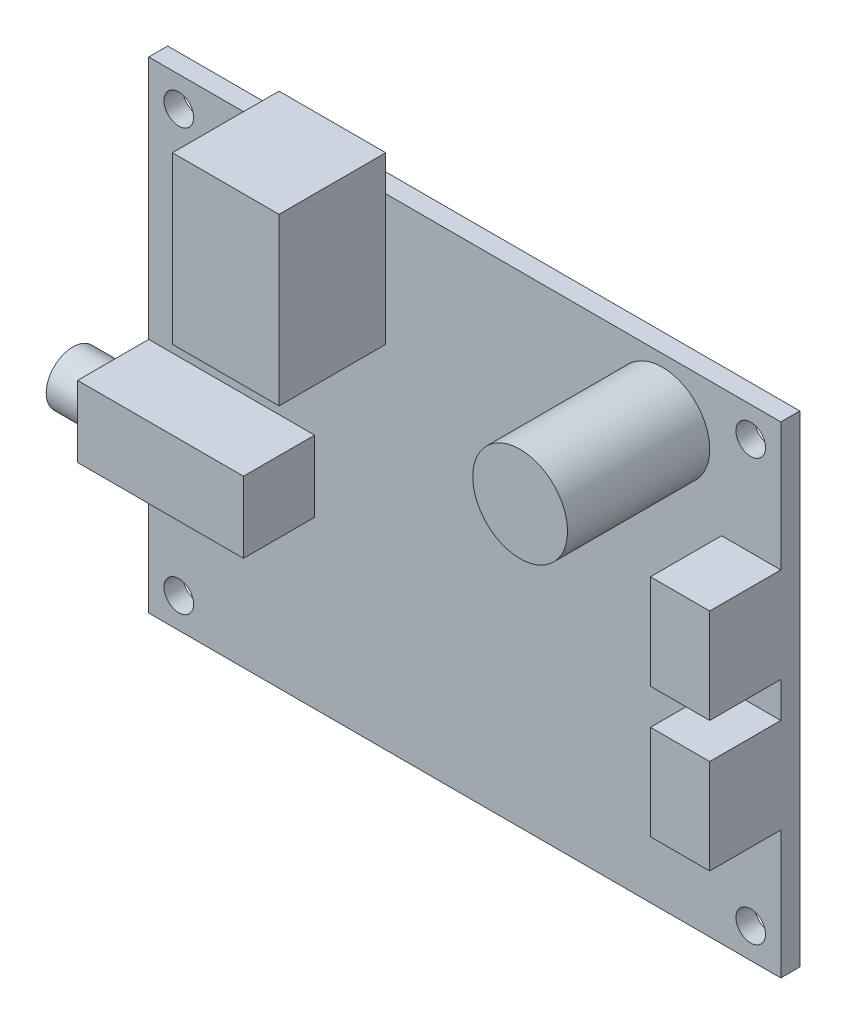
ISO-10303-21;
HEADER;
FILE_DESCRIPTION(('STEP AP214'),'2;1');
FILE_NAME('part.step','',(''),(''),'','','');
FILE_SCHEMA(('AUTOMOTIVE_DESIGN { 1 0 10303 214 1 1 1 1 }'));
ENDSEC;
DATA;
#1=APPLICATION_CONTEXT('core data for automotive mechanical design processes');
#2=APPLICATION_PROTOCOL_DEFINITION('international standard','automotive_design',2000,#1);
#3=PRODUCT_CONTEXT('',#1,'mechanical');
#4=PRODUCT('Part','Part','',(#3));
#5=PRODUCT_RELATED_PRODUCT_CATEGORY('part','',(#4));
#6=PRODUCT_DEFINITION_FORMATION('','',#4);
#7=PRODUCT_DEFINITION_CONTEXT('part definition',#1,'design');
#8=PRODUCT_DEFINITION('design','',#6,#7);
#9=PRODUCT_DEFINITION_SHAPE('','',#8);
#10=(LENGTH_UNIT() NAMED_UNIT(*) SI_UNIT(.MILLI.,.METRE.));
#11=(NAMED_UNIT(*) PLANE_ANGLE_UNIT() SI_UNIT($,.RADIAN.));
#12=(NAMED_UNIT(*) SI_UNIT($,.STERADIAN.) SOLID_ANGLE_UNIT());
#13=UNCERTAINTY_MEASURE_WITH_UNIT(LENGTH_MEASURE(1.E-05),#10,'distance_accuracy_value','');
#14=(GEOMETRIC_REPRESENTATION_CONTEXT(3) GLOBAL_UNCERTAINTY_ASSIGNED_CONTEXT((#13)) GLOBAL_UNIT_ASSIGNED_CONTEXT((#10,
#11,#12)) REPRESENTATION_CONTEXT('',''));
#15=CARTESIAN_POINT('',(0.,0.,0.));
#16=DIRECTION('',(0.,0.,1.));
#17=DIRECTION('',(1.,0.,0.));
#18=AXIS2_PLACEMENT_3D('',#15,#16,#17);
#19=CARTESIAN_POINT('',(0.,0.,1.6));
#20=DIRECTION('',(0.,0.,1.));
#21=DIRECTION('',(1.,0.,0.));
#22=AXIS2_PLACEMENT_3D('',#19,#20,#21);
#23=PLANE('',#22);
#24=CARTESIAN_POINT('',(16.67,15.32,1.6));
#25=DIRECTION('',(0.,0.,1.));
#26=DIRECTION('',(1.,0.,0.));
#27=AXIS2_PLACEMENT_3D('',#24,#25,#26);
#28=CIRCLE('',#27,4.);
#29=CARTESIAN_POINT('',(20.67,15.32,1.6));
#30=VERTEX_POINT('',#29);
#31=EDGE_CURVE('E476',#30,#30,#28,.T.);
#32=ORIENTED_EDGE('',*,*,#31,.F.);
#33=EDGE_LOOP('',(#32));
#34=FACE_BOUND('',#33,.T.);
#35=CARTESIAN_POINT('',(24.13,17.78,1.6));
#36=DIRECTION('',(0.,0.,1.));
#37=DIRECTION('',(1.,0.,0.));
#38=AXIS2_PLACEMENT_3D('',#35,#36,#37);
#39=CIRCLE('',#38,1.25);
#40=CARTESIAN_POINT('',(25.38,17.78,1.6));
#41=VERTEX_POINT('',#40);
#42=EDGE_CURVE('E353',#41,#41,#39,.T.);
#43=ORIENTED_EDGE('',*,*,#42,.F.);
#44=EDGE_LOOP('',(#43));
#45=FACE_BOUND('',#44,.T.);
#46=CARTESIAN_POINT('',(-24.13,17.78,1.6));
#47=DIRECTION('',(0.,0.,1.));
#48=DIRECTION('',(1.,0.,0.));
#49=AXIS2_PLACEMENT_3D('',#46,#47,#48);
#50=CIRCLE('',#49,1.25);
#51=CARTESIAN_POINT('',(-22.88,17.78,1.6));
#52=VERTEX_POINT('',#51);
#53=EDGE_CURVE('E369',#52,#52,#50,.T.);
#54=ORIENTED_EDGE('',*,*,#53,.F.);
#55=EDGE_LOOP('',(#54));
#56=FACE_BOUND('',#55,.T.);
#57=CARTESIAN_POINT('',(24.13,-17.78,1.6));
#58=DIRECTION('',(0.,0.,1.));
#59=DIRECTION('',(1.,0.,0.));
#60=AXIS2_PLACEMENT_3D('',#57,#58,#59);
#61=CIRCLE('',#60,1.25);
#62=CARTESIAN_POINT('',(25.38,-17.78,1.6));
#63=VERTEX_POINT('',#62);
#64=EDGE_CURVE('E361',#63,#63,#61,.T.);
#65=ORIENTED_EDGE('',*,*,#64,.F.);
#66=EDGE_LOOP('',(#65));
#67=FACE_BOUND('',#66,.T.);
#68=CARTESIAN_POINT('',(-24.13,-17.78,1.6));
#69=DIRECTION('',(0.,0.,1.));
#70=DIRECTION('',(1.,0.,0.));
#71=AXIS2_PLACEMENT_3D('',#68,#69,#70);
#72=CIRCLE('',#71,1.25);
#73=CARTESIAN_POINT('',(-22.88,-17.78,1.6));
#74=VERTEX_POINT('',#73);
#75=EDGE_CURVE('E345',#74,#74,#72,.T.);
#76=ORIENTED_EDGE('',*,*,#75,.F.);
#77=EDGE_LOOP('',(#76));
#78=FACE_BOUND('',#77,.T.);
#79=DIRECTION('',(1.,0.,0.));
#80=VECTOR('',#79,1.);
#81=CARTESIAN_POINT('',(-15.67,9.32,1.6));
#82=LINE('',#81,#80);
#83=CARTESIAN_POINT('',(-15.67,9.32,1.6));
#84=VERTEX_POINT('',#83);
#85=CARTESIAN_POINT('',(-6.67000000000001,9.32,1.6));
#86=VERTEX_POINT('',#85);
#87=EDGE_CURVE('E56',#84,#86,#82,.T.);
#88=ORIENTED_EDGE('',*,*,#87,.F.);
#89=DIRECTION('',(0.,-1.,0.));
#90=VECTOR('',#89,1.);
#91=CARTESIAN_POINT('',(-15.67,23.32,1.6));
#92=LINE('',#91,#90);
#93=CARTESIAN_POINT('',(-15.67,20.32,1.6));
#94=VERTEX_POINT('',#93);
#95=EDGE_CURVE('E209',#94,#84,#92,.T.);
#96=ORIENTED_EDGE('',*,*,#95,.F.);
#97=DIRECTION('',(-1.,0.,0.));
#98=VECTOR('',#97,1.);
#99=CARTESIAN_POINT('',(-26.67,20.32,1.6));
#100=LINE('',#99,#98);
#101=CARTESIAN_POINT('',(-26.67,20.32,1.6));
#102=VERTEX_POINT('',#101);
#103=EDGE_CURVE('E388',#94,#102,#100,.T.);
#104=ORIENTED_EDGE('',*,*,#103,.T.);
#105=DIRECTION('',(0.,-1.,0.));
#106=VECTOR('',#105,1.);
#107=CARTESIAN_POINT('',(-26.67,20.32,1.6));
#108=LINE('',#107,#106);
#109=CARTESIAN_POINT('',(-26.67,-0.319999999999997,1.6));
#110=VERTEX_POINT('',#109);
#111=EDGE_CURVE('E377',#102,#110,#108,.T.);
#112=ORIENTED_EDGE('',*,*,#111,.T.);
#113=DIRECTION('',(-1.,0.,0.));
#114=VECTOR('',#113,1.);
#115=CARTESIAN_POINT('',(-26.67,-0.319999999999997,1.6));
#116=LINE('',#115,#114);
#117=CARTESIAN_POINT('',(-12.67,-0.319999999999997,1.6));
#118=VERTEX_POINT('',#117);
#119=EDGE_CURVE('E309',#118,#110,#116,.T.);
#120=ORIENTED_EDGE('',*,*,#119,.F.);
#121=DIRECTION('',(0.,1.,0.));
#122=VECTOR('',#121,1.);
#123=CARTESIAN_POINT('',(-12.67,-0.319999999999997,1.6));
#124=LINE('',#123,#122);
#125=CARTESIAN_POINT('',(-12.67,-6.32,1.6));
#126=VERTEX_POINT('',#125);
#127=EDGE_CURVE('E322',#126,#118,#124,.T.);
#128=ORIENTED_EDGE('',*,*,#127,.F.);
#129=DIRECTION('',(1.,0.,0.));
#130=VECTOR('',#129,1.);
#131=CARTESIAN_POINT('',(-26.67,-6.32,1.6));
#132=LINE('',#131,#130);
#133=CARTESIAN_POINT('',(-26.67,-6.32,1.6));
#134=VERTEX_POINT('',#133);
#135=EDGE_CURVE('E303',#134,#126,#132,.T.);
#136=ORIENTED_EDGE('',*,*,#135,.F.);
#137=CARTESIAN_POINT('',(-26.67,-20.32,1.6));
#138=VERTEX_POINT('',#137);
#139=EDGE_CURVE('E381',#134,#138,#108,.T.);
#140=ORIENTED_EDGE('',*,*,#139,.T.);
#141=DIRECTION('',(1.,0.,0.));
#142=VECTOR('',#141,1.);
#143=CARTESIAN_POINT('',(-26.67,-20.32,1.6));
#144=LINE('',#143,#142);
#145=CARTESIAN_POINT('',(26.67,-20.32,1.6));
#146=VERTEX_POINT('',#145);
#147=EDGE_CURVE('E380',#138,#146,#144,.T.);
#148=ORIENTED_EDGE('',*,*,#147,.T.);
#149=DIRECTION('',(0.,1.,0.));
#150=VECTOR('',#149,1.);
#151=CARTESIAN_POINT('',(26.67,20.32,1.6));
#152=LINE('',#151,#150);
#153=CARTESIAN_POINT('',(26.67,-9.5,1.6));
#154=VERTEX_POINT('',#153);
#155=EDGE_CURVE('E385',#146,#154,#152,.T.);
#156=ORIENTED_EDGE('',*,*,#155,.T.);
#157=DIRECTION('',(1.,0.,0.));
#158=VECTOR('',#157,1.);
#159=CARTESIAN_POINT('',(26.67,-9.5,1.6));
#160=LINE('',#159,#158);
#161=CARTESIAN_POINT('',(21.67,-9.5,1.6));
#162=VERTEX_POINT('',#161);
#163=EDGE_CURVE('E227',#162,#154,#160,.T.);
#164=ORIENTED_EDGE('',*,*,#163,.F.);
#165=DIRECTION('',(0.,-1.,0.));
#166=VECTOR('',#165,1.);
#167=CARTESIAN_POINT('',(21.67,-9.5,1.6));
#168=LINE('',#167,#166);
#169=CARTESIAN_POINT('',(21.67,-1.5,1.6));
#170=VERTEX_POINT('',#169);
#171=EDGE_CURVE('E240',#170,#162,#168,.T.);
#172=ORIENTED_EDGE('',*,*,#171,.F.);
#173=DIRECTION('',(-1.,0.,0.));
#174=VECTOR('',#173,1.);
#175=CARTESIAN_POINT('',(26.67,-1.5,1.6));
#176=LINE('',#175,#174);
#177=CARTESIAN_POINT('',(26.67,-1.5,1.6));
#178=VERTEX_POINT('',#177);
#179=EDGE_CURVE('E216',#178,#170,#176,.T.);
#180=ORIENTED_EDGE('',*,*,#179,.F.);
#181=CARTESIAN_POINT('',(26.67,1.5,1.6));
#182=VERTEX_POINT('',#181);
#183=EDGE_CURVE('E389',#178,#182,#152,.T.);
#184=ORIENTED_EDGE('',*,*,#183,.T.);
#185=DIRECTION('',(1.,0.,0.));
#186=VECTOR('',#185,1.);
#187=CARTESIAN_POINT('',(26.67,1.5,1.6));
#188=LINE('',#187,#186);
#189=CARTESIAN_POINT('',(21.67,1.5,1.6));
#190=VERTEX_POINT('',#189);
#191=EDGE_CURVE('E268',#190,#182,#188,.T.);
#192=ORIENTED_EDGE('',*,*,#191,.F.);
#193=DIRECTION('',(0.,-1.,0.));
#194=VECTOR('',#193,1.);
#195=CARTESIAN_POINT('',(21.67,9.5,1.6));
#196=LINE('',#195,#194);
#197=CARTESIAN_POINT('',(21.67,9.5,1.6));
#198=VERTEX_POINT('',#197);
#199=EDGE_CURVE('E281',#198,#190,#196,.T.);
#200=ORIENTED_EDGE('',*,*,#199,.F.);
#201=DIRECTION('',(-1.,0.,0.));
#202=VECTOR('',#201,1.);
#203=CARTESIAN_POINT('',(26.67,9.5,1.6));
#204=LINE('',#203,#202);
#205=CARTESIAN_POINT('',(26.67,9.5,1.6));
#206=VERTEX_POINT('',#205);
#207=EDGE_CURVE('E262',#206,#198,#204,.T.);
#208=ORIENTED_EDGE('',*,*,#207,.F.);
#209=CARTESIAN_POINT('',(26.67,20.32,1.6));
#210=VERTEX_POINT('',#209);
#211=EDGE_CURVE('E384',#206,#210,#152,.T.);
#212=ORIENTED_EDGE('',*,*,#211,.T.);
#213=CARTESIAN_POINT('',(-6.67000000000001,20.32,1.6));
#214=VERTEX_POINT('',#213);
#215=EDGE_CURVE('E390',#210,#214,#100,.T.);
#216=ORIENTED_EDGE('',*,*,#215,.T.);
#217=DIRECTION('',(0.,1.,0.));
#218=VECTOR('',#217,1.);
#219=CARTESIAN_POINT('',(-6.67000000000001,23.32,1.6));
#220=LINE('',#219,#218);
#221=EDGE_CURVE('E61',#86,#214,#220,.T.);
#222=ORIENTED_EDGE('',*,*,#221,.F.);
#223=EDGE_LOOP('',(#88,#96,#104,#112,#120,#128,#136,#140,#148,#156,#164,#172,#180,#184,#192,
#200,#208,#212,#216,#222));
#224=FACE_BOUND('',#223,.T.);
#225=ADVANCED_FACE('F39',(#34,#45,#56,#67,#78,#224),#23,.T.);
#226=CARTESIAN_POINT('',(0.,0.,0.));
#227=DIRECTION('',(0.,0.,1.));
#228=DIRECTION('',(1.,0.,0.));
#229=AXIS2_PLACEMENT_3D('',#226,#227,#228);
#230=PLANE('',#229);
#231=DIRECTION('',(0.,-1.,0.));
#232=VECTOR('',#231,1.);
#233=CARTESIAN_POINT('',(-26.67,20.32,0.));
#234=LINE('',#233,#232);
#235=CARTESIAN_POINT('',(-26.67,20.32,0.));
#236=VERTEX_POINT('',#235);
#237=CARTESIAN_POINT('',(-26.67,-20.32,0.));
#238=VERTEX_POINT('',#237);
#239=EDGE_CURVE('E373',#236,#238,#234,.T.);
#240=ORIENTED_EDGE('',*,*,#239,.F.);
#241=DIRECTION('',(-1.,0.,0.));
#242=VECTOR('',#241,1.);
#243=CARTESIAN_POINT('',(-26.67,20.32,0.));
#244=LINE('',#243,#242);
#245=CARTESIAN_POINT('',(26.67,20.32,0.));
#246=VERTEX_POINT('',#245);
#247=EDGE_CURVE('E404',#246,#236,#244,.T.);
#248=ORIENTED_EDGE('',*,*,#247,.F.);
#249=DIRECTION('',(0.,1.,0.));
#250=VECTOR('',#249,1.);
#251=CARTESIAN_POINT('',(26.67,20.32,0.));
#252=LINE('',#251,#250);
#253=CARTESIAN_POINT('',(26.67,-20.32,0.));
#254=VERTEX_POINT('',#253);
#255=EDGE_CURVE('E401',#254,#246,#252,.T.);
#256=ORIENTED_EDGE('',*,*,#255,.F.);
#257=DIRECTION('',(1.,0.,0.));
#258=VECTOR('',#257,1.);
#259=CARTESIAN_POINT('',(-26.67,-20.32,0.));
#260=LINE('',#259,#258);
#261=EDGE_CURVE('E398',#238,#254,#260,.T.);
#262=ORIENTED_EDGE('',*,*,#261,.F.);
#263=EDGE_LOOP('',(#240,#248,#256,#262));
#264=FACE_BOUND('',#263,.T.);
#265=CARTESIAN_POINT('',(-24.13,17.78,0.));
#266=DIRECTION('',(0.,0.,1.));
#267=DIRECTION('',(1.,0.,0.));
#268=AXIS2_PLACEMENT_3D('',#265,#266,#267);
#269=CIRCLE('',#268,1.25);
#270=CARTESIAN_POINT('',(-22.88,17.78,0.));
#271=VERTEX_POINT('',#270);
#272=EDGE_CURVE('E365',#271,#271,#269,.T.);
#273=ORIENTED_EDGE('',*,*,#272,.T.);
#274=EDGE_LOOP('',(#273));
#275=FACE_BOUND('',#274,.T.);
#276=CARTESIAN_POINT('',(24.13,-17.78,0.));
#277=DIRECTION('',(0.,0.,1.));
#278=DIRECTION('',(1.,0.,0.));
#279=AXIS2_PLACEMENT_3D('',#276,#277,#278);
#280=CIRCLE('',#279,1.25);
#281=CARTESIAN_POINT('',(25.38,-17.78,0.));
#282=VERTEX_POINT('',#281);
#283=EDGE_CURVE('E357',#282,#282,#280,.T.);
#284=ORIENTED_EDGE('',*,*,#283,.T.);
#285=EDGE_LOOP('',(#284));
#286=FACE_BOUND('',#285,.T.);
#287=CARTESIAN_POINT('',(24.13,17.78,0.));
#288=DIRECTION('',(0.,0.,1.));
#289=DIRECTION('',(1.,0.,0.));
#290=AXIS2_PLACEMENT_3D('',#287,#288,#289);
#291=CIRCLE('',#290,1.25);
#292=CARTESIAN_POINT('',(25.38,17.78,0.));
#293=VERTEX_POINT('',#292);
#294=EDGE_CURVE('E349',#293,#293,#291,.T.);
#295=ORIENTED_EDGE('',*,*,#294,.T.);
#296=EDGE_LOOP('',(#295));
#297=FACE_BOUND('',#296,.T.);
#298=CARTESIAN_POINT('',(-24.13,-17.78,0.));
#299=DIRECTION('',(0.,0.,1.));
#300=DIRECTION('',(1.,0.,0.));
#301=AXIS2_PLACEMENT_3D('',#298,#299,#300);
#302=CIRCLE('',#301,1.25);
#303=CARTESIAN_POINT('',(-22.88,-17.78,0.));
#304=VERTEX_POINT('',#303);
#305=EDGE_CURVE('E344',#304,#304,#302,.T.);
#306=ORIENTED_EDGE('',*,*,#305,.T.);
#307=EDGE_LOOP('',(#306));
#308=FACE_BOUND('',#307,.T.);
#309=ADVANCED_FACE('F433',(#264,#275,#286,#297,#308),#230,.F.);
#310=CARTESIAN_POINT('',(-26.67,20.32,1.6));
#311=DIRECTION('',(1.,0.,0.));
#312=DIRECTION('',(0.,1.,0.));
#313=AXIS2_PLACEMENT_3D('',#310,#311,#312);
#314=PLANE('',#313);
#315=CARTESIAN_POINT('',(-26.67,-3.32,4.6));
#316=DIRECTION('',(-1.,0.,0.));
#317=DIRECTION('',(0.,-1.,0.));
#318=AXIS2_PLACEMENT_3D('',#315,#316,#317);
#319=CIRCLE('',#318,2.25);
#320=CARTESIAN_POINT('',(-26.67,-5.57,4.6));
#321=VERTEX_POINT('',#320);
#322=EDGE_CURVE('E11',#321,#321,#319,.T.);
#323=ORIENTED_EDGE('',*,*,#322,.F.);
#324=EDGE_LOOP('',(#323));
#325=FACE_BOUND('',#324,.T.);
#326=ORIENTED_EDGE('',*,*,#239,.T.);
#327=DIRECTION('',(0.,0.,-1.));
#328=VECTOR('',#327,1.);
#329=CARTESIAN_POINT('',(-26.67,-20.32,1.6));
#330=LINE('',#329,#328);
#331=EDGE_CURVE('E43',#138,#238,#330,.T.);
#332=ORIENTED_EDGE('',*,*,#331,.F.);
#333=ORIENTED_EDGE('',*,*,#139,.F.);
#334=DIRECTION('',(0.,0.,-1.));
#335=VECTOR('',#334,1.);
#336=CARTESIAN_POINT('',(-26.67,-6.32,7.6));
#337=LINE('',#336,#335);
#338=CARTESIAN_POINT('',(-26.67,-6.32,7.6));
#339=VERTEX_POINT('',#338);
#340=EDGE_CURVE('E340',#339,#134,#337,.T.);
#341=ORIENTED_EDGE('',*,*,#340,.F.);
#342=DIRECTION('',(0.,-1.,0.));
#343=VECTOR('',#342,1.);
#344=CARTESIAN_POINT('',(-26.67,-0.319999999999997,7.6));
#345=LINE('',#344,#343);
#346=CARTESIAN_POINT('',(-26.67,-0.319999999999997,7.6));
#347=VERTEX_POINT('',#346);
#348=EDGE_CURVE('E304',#347,#339,#345,.T.);
#349=ORIENTED_EDGE('',*,*,#348,.F.);
#350=DIRECTION('',(0.,0.,-1.));
#351=VECTOR('',#350,1.);
#352=CARTESIAN_POINT('',(-26.67,-0.319999999999997,7.6));
#353=LINE('',#352,#351);
#354=EDGE_CURVE('E318',#347,#110,#353,.T.);
#355=ORIENTED_EDGE('',*,*,#354,.T.);
#356=ORIENTED_EDGE('',*,*,#111,.F.);
#357=DIRECTION('',(0.,0.,-1.));
#358=VECTOR('',#357,1.);
#359=CARTESIAN_POINT('',(-26.67,20.32,1.6));
#360=LINE('',#359,#358);
#361=EDGE_CURVE('E393',#102,#236,#360,.T.);
#362=ORIENTED_EDGE('',*,*,#361,.T.);
#363=EDGE_LOOP('',(#326,#332,#333,#341,#349,#355,#356,#362));
#364=FACE_BOUND('',#363,.T.);
#365=ADVANCED_FACE('F41',(#325,#364),#314,.F.);
#366=CARTESIAN_POINT('',(-26.67,-20.32,1.6));
#367=DIRECTION('',(0.,1.,0.));
#368=DIRECTION('',(0.,0.,1.));
#369=AXIS2_PLACEMENT_3D('',#366,#367,#368);
#370=PLANE('',#369);
#371=ORIENTED_EDGE('',*,*,#261,.T.);
#372=DIRECTION('',(0.,0.,-1.));
#373=VECTOR('',#372,1.);
#374=CARTESIAN_POINT('',(26.67,-20.32,1.6));
#375=LINE('',#374,#373);
#376=EDGE_CURVE('E413',#146,#254,#375,.T.);
#377=ORIENTED_EDGE('',*,*,#376,.F.);
#378=ORIENTED_EDGE('',*,*,#147,.F.);
#379=ORIENTED_EDGE('',*,*,#331,.T.);
#380=EDGE_LOOP('',(#371,#377,#378,#379));
#381=FACE_BOUND('',#380,.T.);
#382=ADVANCED_FACE('F425',(#381),#370,.F.);
#383=CARTESIAN_POINT('',(26.67,20.32,1.6));
#384=DIRECTION('',(-1.,0.,0.));
#385=DIRECTION('',(0.,-1.,0.));
#386=AXIS2_PLACEMENT_3D('',#383,#384,#385);
#387=PLANE('',#386);
#388=ORIENTED_EDGE('',*,*,#255,.T.);
#389=DIRECTION('',(0.,0.,-1.));
#390=VECTOR('',#389,1.);
#391=CARTESIAN_POINT('',(26.67,20.32,1.6));
#392=LINE('',#391,#390);
#393=EDGE_CURVE('E410',#210,#246,#392,.T.);
#394=ORIENTED_EDGE('',*,*,#393,.F.);
#395=ORIENTED_EDGE('',*,*,#211,.F.);
#396=DIRECTION('',(0.,0.,-1.));
#397=VECTOR('',#396,1.);
#398=CARTESIAN_POINT('',(26.67,9.5,7.6));
#399=LINE('',#398,#397);
#400=CARTESIAN_POINT('',(26.67,9.5,7.6));
#401=VERTEX_POINT('',#400);
#402=EDGE_CURVE('E299',#401,#206,#399,.T.);
#403=ORIENTED_EDGE('',*,*,#402,.F.);
#404=DIRECTION('',(0.,1.,0.));
#405=VECTOR('',#404,1.);
#406=CARTESIAN_POINT('',(26.67,9.5,7.6));
#407=LINE('',#406,#405);
#408=CARTESIAN_POINT('',(26.67,1.5,7.6));
#409=VERTEX_POINT('',#408);
#410=EDGE_CURVE('E263',#409,#401,#407,.T.);
#411=ORIENTED_EDGE('',*,*,#410,.F.);
#412=DIRECTION('',(0.,0.,-1.));
#413=VECTOR('',#412,1.);
#414=CARTESIAN_POINT('',(26.67,1.5,7.6));
#415=LINE('',#414,#413);
#416=EDGE_CURVE('E277',#409,#182,#415,.T.);
#417=ORIENTED_EDGE('',*,*,#416,.T.);
#418=ORIENTED_EDGE('',*,*,#183,.F.);
#419=DIRECTION('',(0.,0.,-1.));
#420=VECTOR('',#419,1.);
#421=CARTESIAN_POINT('',(26.67,-1.5,7.6));
#422=LINE('',#421,#420);
#423=CARTESIAN_POINT('',(26.67,-1.5,7.6));
#424=VERTEX_POINT('',#423);
#425=EDGE_CURVE('E258',#424,#178,#422,.T.);
#426=ORIENTED_EDGE('',*,*,#425,.F.);
#427=DIRECTION('',(0.,1.,0.));
#428=VECTOR('',#427,1.);
#429=CARTESIAN_POINT('',(26.67,-9.5,7.6));
#430=LINE('',#429,#428);
#431=CARTESIAN_POINT('',(26.67,-9.5,7.6));
#432=VERTEX_POINT('',#431);
#433=EDGE_CURVE('E222',#432,#424,#430,.T.);
#434=ORIENTED_EDGE('',*,*,#433,.F.);
#435=DIRECTION('',(0.,0.,-1.));
#436=VECTOR('',#435,1.);
#437=CARTESIAN_POINT('',(26.67,-9.5,7.6));
#438=LINE('',#437,#436);
#439=EDGE_CURVE('E236',#432,#154,#438,.T.);
#440=ORIENTED_EDGE('',*,*,#439,.T.);
#441=ORIENTED_EDGE('',*,*,#155,.F.);
#442=ORIENTED_EDGE('',*,*,#376,.T.);
#443=EDGE_LOOP('',(#388,#394,#395,#403,#411,#417,#418,#426,#434,#440,#441,#442));
#444=FACE_BOUND('',#443,.T.);
#445=ADVANCED_FACE('F436',(#444),#387,.F.);
#446=CARTESIAN_POINT('',(-26.67,20.32,1.6));
#447=DIRECTION('',(0.,-1.,0.));
#448=DIRECTION('',(0.,0.,-1.));
#449=AXIS2_PLACEMENT_3D('',#446,#447,#448);
#450=PLANE('',#449);
#451=ORIENTED_EDGE('',*,*,#247,.T.);
#452=ORIENTED_EDGE('',*,*,#361,.F.);
#453=ORIENTED_EDGE('',*,*,#103,.F.);
#454=EDGE_CURVE('E394',#214,#94,#100,.T.);
#455=ORIENTED_EDGE('',*,*,#454,.F.);
#456=ORIENTED_EDGE('',*,*,#215,.F.);
#457=ORIENTED_EDGE('',*,*,#393,.T.);
#458=EDGE_LOOP('',(#451,#452,#453,#455,#456,#457));
#459=FACE_BOUND('',#458,.T.);
#460=ADVANCED_FACE('F439',(#459),#450,.F.);
#461=CARTESIAN_POINT('',(-24.13,17.78,1.6));
#462=DIRECTION('',(0.,0.,-1.));
#463=DIRECTION('',(-1.,0.,0.));
#464=AXIS2_PLACEMENT_3D('',#461,#462,#463);
#465=CYLINDRICAL_SURFACE('',#464,1.25);
#466=ORIENTED_EDGE('',*,*,#53,.T.);
#467=EDGE_LOOP('',(#466));
#468=FACE_BOUND('',#467,.T.);
#469=ORIENTED_EDGE('',*,*,#272,.F.);
#470=EDGE_LOOP('',(#469));
#471=FACE_BOUND('',#470,.T.);
#472=ADVANCED_FACE('F516',(#468,#471),#465,.F.);
#473=CARTESIAN_POINT('',(24.13,-17.78,1.6));
#474=DIRECTION('',(0.,0.,-1.));
#475=DIRECTION('',(-1.,0.,0.));
#476=AXIS2_PLACEMENT_3D('',#473,#474,#475);
#477=CYLINDRICAL_SURFACE('',#476,1.25);
#478=ORIENTED_EDGE('',*,*,#64,.T.);
#479=EDGE_LOOP('',(#478));
#480=FACE_BOUND('',#479,.T.);
#481=ORIENTED_EDGE('',*,*,#283,.F.);
#482=EDGE_LOOP('',(#481));
#483=FACE_BOUND('',#482,.T.);
#484=ADVANCED_FACE('F541',(#480,#483),#477,.F.);
#485=CARTESIAN_POINT('',(24.13,17.78,1.6));
#486=DIRECTION('',(0.,0.,-1.));
#487=DIRECTION('',(-1.,0.,0.));
#488=AXIS2_PLACEMENT_3D('',#485,#486,#487);
#489=CYLINDRICAL_SURFACE('',#488,1.25);
#490=ORIENTED_EDGE('',*,*,#42,.T.);
#491=EDGE_LOOP('',(#490));
#492=FACE_BOUND('',#491,.T.);
#493=ORIENTED_EDGE('',*,*,#294,.F.);
#494=EDGE_LOOP('',(#493));
#495=FACE_BOUND('',#494,.T.);
#496=ADVANCED_FACE('F502',(#492,#495),#489,.F.);
#497=CARTESIAN_POINT('',(-24.13,-17.78,1.6));
#498=DIRECTION('',(0.,0.,-1.));
#499=DIRECTION('',(-1.,0.,0.));
#500=AXIS2_PLACEMENT_3D('',#497,#498,#499);
#501=CYLINDRICAL_SURFACE('',#500,1.25);
#502=ORIENTED_EDGE('',*,*,#75,.T.);
#503=EDGE_LOOP('',(#502));
#504=FACE_BOUND('',#503,.T.);
#505=ORIENTED_EDGE('',*,*,#305,.F.);
#506=EDGE_LOOP('',(#505));
#507=FACE_BOUND('',#506,.T.);
#508=ADVANCED_FACE('F498',(#504,#507),#501,.F.);
#509=CARTESIAN_POINT('',(-26.67,-6.32,7.6));
#510=DIRECTION('',(0.,1.,0.));
#511=DIRECTION('',(0.,0.,1.));
#512=AXIS2_PLACEMENT_3D('',#509,#510,#511);
#513=PLANE('',#512);
#514=ORIENTED_EDGE('',*,*,#135,.T.);
#515=DIRECTION('',(0.,0.,-1.));
#516=VECTOR('',#515,1.);
#517=CARTESIAN_POINT('',(-12.67,-6.32,7.6));
#518=LINE('',#517,#516);
#519=CARTESIAN_POINT('',(-12.67,-6.32,7.6));
#520=VERTEX_POINT('',#519);
#521=EDGE_CURVE('E336',#520,#126,#518,.T.);
#522=ORIENTED_EDGE('',*,*,#521,.F.);
#523=DIRECTION('',(1.,0.,0.));
#524=VECTOR('',#523,1.);
#525=CARTESIAN_POINT('',(-26.67,-6.32,7.6));
#526=LINE('',#525,#524);
#527=EDGE_CURVE('E308',#339,#520,#526,.T.);
#528=ORIENTED_EDGE('',*,*,#527,.F.);
#529=ORIENTED_EDGE('',*,*,#340,.T.);
#530=EDGE_LOOP('',(#514,#522,#528,#529));
#531=FACE_BOUND('',#530,.T.);
#532=ADVANCED_FACE('F501',(#531),#513,.F.);
#533=CARTESIAN_POINT('',(-12.67,-0.319999999999997,7.6));
#534=DIRECTION('',(-1.,0.,0.));
#535=DIRECTION('',(0.,-1.,0.));
#536=AXIS2_PLACEMENT_3D('',#533,#534,#535);
#537=PLANE('',#536);
#538=ORIENTED_EDGE('',*,*,#127,.T.);
#539=DIRECTION('',(0.,0.,-1.));
#540=VECTOR('',#539,1.);
#541=CARTESIAN_POINT('',(-12.67,-0.319999999999997,7.6));
#542=LINE('',#541,#540);
#543=CARTESIAN_POINT('',(-12.67,-0.319999999999997,7.6));
#544=VERTEX_POINT('',#543);
#545=EDGE_CURVE('E332',#544,#118,#542,.T.);
#546=ORIENTED_EDGE('',*,*,#545,.F.);
#547=DIRECTION('',(0.,1.,0.));
#548=VECTOR('',#547,1.);
#549=CARTESIAN_POINT('',(-12.67,-0.319999999999997,7.6));
#550=LINE('',#549,#548);
#551=EDGE_CURVE('E312',#520,#544,#550,.T.);
#552=ORIENTED_EDGE('',*,*,#551,.F.);
#553=ORIENTED_EDGE('',*,*,#521,.T.);
#554=EDGE_LOOP('',(#538,#546,#552,#553));
#555=FACE_BOUND('',#554,.T.);
#556=ADVANCED_FACE('F564',(#555),#537,.F.);
#557=CARTESIAN_POINT('',(-26.67,-0.319999999999997,7.6));
#558=DIRECTION('',(0.,-1.,0.));
#559=DIRECTION('',(0.,0.,-1.));
#560=AXIS2_PLACEMENT_3D('',#557,#558,#559);
#561=PLANE('',#560);
#562=ORIENTED_EDGE('',*,*,#119,.T.);
#563=ORIENTED_EDGE('',*,*,#354,.F.);
#564=DIRECTION('',(-1.,0.,0.));
#565=VECTOR('',#564,1.);
#566=CARTESIAN_POINT('',(-26.67,-0.319999999999997,7.6));
#567=LINE('',#566,#565);
#568=EDGE_CURVE('E315',#544,#347,#567,.T.);
#569=ORIENTED_EDGE('',*,*,#568,.F.);
#570=ORIENTED_EDGE('',*,*,#545,.T.);
#571=EDGE_LOOP('',(#562,#563,#569,#570));
#572=FACE_BOUND('',#571,.T.);
#573=ADVANCED_FACE('F572',(#572),#561,.F.);
#574=CARTESIAN_POINT('',(0.,0.,7.6));
#575=DIRECTION('',(0.,0.,1.));
#576=DIRECTION('',(1.,0.,0.));
#577=AXIS2_PLACEMENT_3D('',#574,#575,#576);
#578=PLANE('',#577);
#579=ORIENTED_EDGE('',*,*,#348,.T.);
#580=ORIENTED_EDGE('',*,*,#527,.T.);
#581=ORIENTED_EDGE('',*,*,#551,.T.);
#582=ORIENTED_EDGE('',*,*,#568,.T.);
#583=EDGE_LOOP('',(#579,#580,#581,#582));
#584=FACE_BOUND('',#583,.T.);
#585=ADVANCED_FACE('F580',(#584),#578,.T.);
#586=CARTESIAN_POINT('',(26.67,9.5,7.6));
#587=DIRECTION('',(0.,-1.,0.));
#588=DIRECTION('',(0.,0.,-1.));
#589=AXIS2_PLACEMENT_3D('',#586,#587,#588);
#590=PLANE('',#589);
#591=ORIENTED_EDGE('',*,*,#207,.T.);
#592=DIRECTION('',(0.,0.,-1.));
#593=VECTOR('',#592,1.);
#594=CARTESIAN_POINT('',(21.67,9.5,7.6));
#595=LINE('',#594,#593);
#596=CARTESIAN_POINT('',(21.67,9.5,7.6));
#597=VERTEX_POINT('',#596);
#598=EDGE_CURVE('E295',#597,#198,#595,.T.);
#599=ORIENTED_EDGE('',*,*,#598,.F.);
#600=DIRECTION('',(-1.,0.,0.));
#601=VECTOR('',#600,1.);
#602=CARTESIAN_POINT('',(26.67,9.5,7.6));
#603=LINE('',#602,#601);
#604=EDGE_CURVE('E267',#401,#597,#603,.T.);
#605=ORIENTED_EDGE('',*,*,#604,.F.);
#606=ORIENTED_EDGE('',*,*,#402,.T.);
#607=EDGE_LOOP('',(#591,#599,#605,#606));
#608=FACE_BOUND('',#607,.T.);
#609=ADVANCED_FACE('F588',(#608),#590,.F.);
#610=CARTESIAN_POINT('',(21.67,9.5,7.6));
#611=DIRECTION('',(1.,0.,0.));
#612=DIRECTION('',(0.,0.,-1.));
#613=AXIS2_PLACEMENT_3D('',#610,#611,#612);
#614=PLANE('',#613);
#615=ORIENTED_EDGE('',*,*,#199,.T.);
#616=DIRECTION('',(0.,0.,-1.));
#617=VECTOR('',#616,1.);
#618=CARTESIAN_POINT('',(21.67,1.5,7.6));
#619=LINE('',#618,#617);
#620=CARTESIAN_POINT('',(21.67,1.5,7.6));
#621=VERTEX_POINT('',#620);
#622=EDGE_CURVE('E291',#621,#190,#619,.T.);
#623=ORIENTED_EDGE('',*,*,#622,.F.);
#624=DIRECTION('',(0.,-1.,0.));
#625=VECTOR('',#624,1.);
#626=CARTESIAN_POINT('',(21.67,9.5,7.6));
#627=LINE('',#626,#625);
#628=EDGE_CURVE('E271',#597,#621,#627,.T.);
#629=ORIENTED_EDGE('',*,*,#628,.F.);
#630=ORIENTED_EDGE('',*,*,#598,.T.);
#631=EDGE_LOOP('',(#615,#623,#629,#630));
#632=FACE_BOUND('',#631,.T.);
#633=ADVANCED_FACE('F596',(#632),#614,.F.);
#634=CARTESIAN_POINT('',(26.67,1.5,7.6));
#635=DIRECTION('',(0.,1.,0.));
#636=DIRECTION('',(-1.,0.,0.));
#637=AXIS2_PLACEMENT_3D('',#634,#635,#636);
#638=PLANE('',#637);
#639=ORIENTED_EDGE('',*,*,#191,.T.);
#640=ORIENTED_EDGE('',*,*,#416,.F.);
#641=DIRECTION('',(1.,0.,0.));
#642=VECTOR('',#641,1.);
#643=CARTESIAN_POINT('',(26.67,1.5,7.6));
#644=LINE('',#643,#642);
#645=EDGE_CURVE('E274',#621,#409,#644,.T.);
#646=ORIENTED_EDGE('',*,*,#645,.F.);
#647=ORIENTED_EDGE('',*,*,#622,.T.);
#648=EDGE_LOOP('',(#639,#640,#646,#647));
#649=FACE_BOUND('',#648,.T.);
#650=ADVANCED_FACE('F604',(#649),#638,.F.);
#651=CARTESIAN_POINT('',(0.,0.,7.6));
#652=DIRECTION('',(0.,0.,-1.));
#653=DIRECTION('',(-1.,0.,0.));
#654=AXIS2_PLACEMENT_3D('',#651,#652,#653);
#655=PLANE('',#654);
#656=ORIENTED_EDGE('',*,*,#410,.T.);
#657=ORIENTED_EDGE('',*,*,#604,.T.);
#658=ORIENTED_EDGE('',*,*,#628,.T.);
#659=ORIENTED_EDGE('',*,*,#645,.T.);
#660=EDGE_LOOP('',(#656,#657,#658,#659));
#661=FACE_BOUND('',#660,.T.);
#662=ADVANCED_FACE('F612',(#661),#655,.F.);
#663=CARTESIAN_POINT('',(26.67,-1.5,7.6));
#664=DIRECTION('',(0.,-1.,0.));
#665=DIRECTION('',(1.,0.,0.));
#666=AXIS2_PLACEMENT_3D('',#663,#664,#665);
#667=PLANE('',#666);
#668=ORIENTED_EDGE('',*,*,#179,.T.);
#669=DIRECTION('',(0.,0.,-1.));
#670=VECTOR('',#669,1.);
#671=CARTESIAN_POINT('',(21.67,-1.5,7.6));
#672=LINE('',#671,#670);
#673=CARTESIAN_POINT('',(21.67,-1.5,7.6));
#674=VERTEX_POINT('',#673);
#675=EDGE_CURVE('E254',#674,#170,#672,.T.);
#676=ORIENTED_EDGE('',*,*,#675,.F.);
#677=DIRECTION('',(-1.,0.,0.));
#678=VECTOR('',#677,1.);
#679=CARTESIAN_POINT('',(26.67,-1.5,7.6));
#680=LINE('',#679,#678);
#681=EDGE_CURVE('E226',#424,#674,#680,.T.);
#682=ORIENTED_EDGE('',*,*,#681,.F.);
#683=ORIENTED_EDGE('',*,*,#425,.T.);
#684=EDGE_LOOP('',(#668,#676,#682,#683));
#685=FACE_BOUND('',#684,.T.);
#686=ADVANCED_FACE('F620',(#685),#667,.F.);
#687=CARTESIAN_POINT('',(21.67,-9.5,7.6));
#688=DIRECTION('',(1.,0.,0.));
#689=DIRECTION('',(0.,0.,-1.));
#690=AXIS2_PLACEMENT_3D('',#687,#688,#689);
#691=PLANE('',#690);
#692=ORIENTED_EDGE('',*,*,#171,.T.);
#693=DIRECTION('',(0.,0.,-1.));
#694=VECTOR('',#693,1.);
#695=CARTESIAN_POINT('',(21.67,-9.5,7.6));
#696=LINE('',#695,#694);
#697=CARTESIAN_POINT('',(21.67,-9.5,7.6));
#698=VERTEX_POINT('',#697);
#699=EDGE_CURVE('E250',#698,#162,#696,.T.);
#700=ORIENTED_EDGE('',*,*,#699,.F.);
#701=DIRECTION('',(0.,-1.,0.));
#702=VECTOR('',#701,1.);
#703=CARTESIAN_POINT('',(21.67,-9.5,7.6));
#704=LINE('',#703,#702);
#705=EDGE_CURVE('E230',#674,#698,#704,.T.);
#706=ORIENTED_EDGE('',*,*,#705,.F.);
#707=ORIENTED_EDGE('',*,*,#675,.T.);
#708=EDGE_LOOP('',(#692,#700,#706,#707));
#709=FACE_BOUND('',#708,.T.);
#710=ADVANCED_FACE('F628',(#709),#691,.F.);
#711=CARTESIAN_POINT('',(26.67,-9.5,7.6));
#712=DIRECTION('',(0.,1.,0.));
#713=DIRECTION('',(0.,0.,1.));
#714=AXIS2_PLACEMENT_3D('',#711,#712,#713);
#715=PLANE('',#714);
#716=ORIENTED_EDGE('',*,*,#163,.T.);
#717=ORIENTED_EDGE('',*,*,#439,.F.);
#718=DIRECTION('',(1.,0.,0.));
#719=VECTOR('',#718,1.);
#720=CARTESIAN_POINT('',(26.67,-9.5,7.6));
#721=LINE('',#720,#719);
#722=EDGE_CURVE('E233',#698,#432,#721,.T.);
#723=ORIENTED_EDGE('',*,*,#722,.F.);
#724=ORIENTED_EDGE('',*,*,#699,.T.);
#725=EDGE_LOOP('',(#716,#717,#723,#724));
#726=FACE_BOUND('',#725,.T.);
#727=ADVANCED_FACE('F636',(#726),#715,.F.);
#728=CARTESIAN_POINT('',(0.,0.,7.6));
#729=DIRECTION('',(0.,0.,1.));
#730=DIRECTION('',(1.,0.,0.));
#731=AXIS2_PLACEMENT_3D('',#728,#729,#730);
#732=PLANE('',#731);
#733=ORIENTED_EDGE('',*,*,#433,.T.);
#734=ORIENTED_EDGE('',*,*,#681,.T.);
#735=ORIENTED_EDGE('',*,*,#705,.T.);
#736=ORIENTED_EDGE('',*,*,#722,.T.);
#737=EDGE_LOOP('',(#733,#734,#735,#736));
#738=FACE_BOUND('',#737,.T.);
#739=ADVANCED_FACE('F644',(#738),#732,.T.);
#740=CARTESIAN_POINT('',(-30.07,-3.32,4.6));
#741=DIRECTION('',(1.,0.,0.));
#742=DIRECTION('',(0.,1.,0.));
#743=AXIS2_PLACEMENT_3D('',#740,#741,#742);
#744=CYLINDRICAL_SURFACE('',#743,2.25);
#745=CARTESIAN_POINT('',(-30.07,-3.32,4.6));
#746=DIRECTION('',(-1.,0.,0.));
#747=DIRECTION('',(0.,-1.,0.));
#748=AXIS2_PLACEMENT_3D('',#745,#746,#747);
#749=CIRCLE('',#748,2.25);
#750=CARTESIAN_POINT('',(-30.07,-5.57,4.6));
#751=VERTEX_POINT('',#750);
#752=EDGE_CURVE('E211',#751,#751,#749,.T.);
#753=ORIENTED_EDGE('',*,*,#752,.F.);
#754=EDGE_LOOP('',(#753));
#755=FACE_BOUND('',#754,.T.);
#756=ORIENTED_EDGE('',*,*,#322,.T.);
#757=EDGE_LOOP('',(#756));
#758=FACE_BOUND('',#757,.T.);
#759=ADVANCED_FACE('F652',(#755,#758),#744,.T.);
#760=CARTESIAN_POINT('',(-30.07,-3.32,4.6));
#761=DIRECTION('',(-1.,0.,0.));
#762=DIRECTION('',(0.,-1.,0.));
#763=AXIS2_PLACEMENT_3D('',#760,#761,#762);
#764=PLANE('',#763);
#765=ORIENTED_EDGE('',*,*,#752,.T.);
#766=EDGE_LOOP('',(#765));
#767=FACE_BOUND('',#766,.T.);
#768=ADVANCED_FACE('F660',(#767),#764,.T.);
#769=CARTESIAN_POINT('',(0.,0.,1.6));
#770=DIRECTION('',(0.,0.,1.));
#771=DIRECTION('',(1.,0.,0.));
#772=AXIS2_PLACEMENT_3D('',#769,#770,#771);
#773=PLANE('',#772);
#774=CARTESIAN_POINT('',(-6.67000000000001,23.32,1.6));
#775=VERTEX_POINT('',#774);
#776=EDGE_CURVE('E445',#214,#775,#220,.T.);
#777=ORIENTED_EDGE('',*,*,#776,.F.);
#778=ORIENTED_EDGE('',*,*,#454,.T.);
#779=CARTESIAN_POINT('',(-15.67,23.32,1.6));
#780=VERTEX_POINT('',#779);
#781=EDGE_CURVE('E469',#780,#94,#92,.T.);
#782=ORIENTED_EDGE('',*,*,#781,.F.);
#783=DIRECTION('',(-1.,0.,0.));
#784=VECTOR('',#783,1.);
#785=CARTESIAN_POINT('',(-15.67,23.32,1.6));
#786=LINE('',#785,#784);
#787=EDGE_CURVE('E205',#775,#780,#786,.T.);
#788=ORIENTED_EDGE('',*,*,#787,.F.);
#789=EDGE_LOOP('',(#777,#778,#782,#788));
#790=FACE_BOUND('',#789,.T.);
#791=ADVANCED_FACE('F446',(#790),#773,.F.);
#792=CARTESIAN_POINT('',(-15.67,23.32,10.6));
#793=DIRECTION('',(1.,0.,0.));
#794=DIRECTION('',(0.,0.,-1.));
#795=AXIS2_PLACEMENT_3D('',#792,#793,#794);
#796=PLANE('',#795);
#797=ORIENTED_EDGE('',*,*,#781,.T.);
#798=ORIENTED_EDGE('',*,*,#95,.T.);
#799=DIRECTION('',(0.,0.,-1.));
#800=VECTOR('',#799,1.);
#801=CARTESIAN_POINT('',(-15.67,9.32,10.6));
#802=LINE('',#801,#800);
#803=CARTESIAN_POINT('',(-15.67,9.32,10.6));
#804=VERTEX_POINT('',#803);
#805=EDGE_CURVE('E188',#804,#84,#802,.T.);
#806=ORIENTED_EDGE('',*,*,#805,.F.);
#807=DIRECTION('',(0.,-1.,0.));
#808=VECTOR('',#807,1.);
#809=CARTESIAN_POINT('',(-15.67,23.32,10.6));
#810=LINE('',#809,#808);
#811=CARTESIAN_POINT('',(-15.67,23.32,10.6));
#812=VERTEX_POINT('',#811);
#813=EDGE_CURVE('E195',#812,#804,#810,.T.);
#814=ORIENTED_EDGE('',*,*,#813,.F.);
#815=DIRECTION('',(0.,0.,-1.));
#816=VECTOR('',#815,1.);
#817=CARTESIAN_POINT('',(-15.67,23.32,10.6));
#818=LINE('',#817,#816);
#819=EDGE_CURVE('E460',#812,#780,#818,.T.);
#820=ORIENTED_EDGE('',*,*,#819,.T.);
#821=EDGE_LOOP('',(#797,#798,#806,#814,#820));
#822=FACE_BOUND('',#821,.T.);
#823=ADVANCED_FACE('F208',(#822),#796,.F.);
#824=CARTESIAN_POINT('',(-15.67,9.32,10.6));
#825=DIRECTION('',(0.,1.,0.));
#826=DIRECTION('',(0.,0.,1.));
#827=AXIS2_PLACEMENT_3D('',#824,#825,#826);
#828=PLANE('',#827);
#829=ORIENTED_EDGE('',*,*,#87,.T.);
#830=DIRECTION('',(0.,0.,-1.));
#831=VECTOR('',#830,1.);
#832=CARTESIAN_POINT('',(-6.67000000000001,9.32,10.6));
#833=LINE('',#832,#831);
#834=CARTESIAN_POINT('',(-6.67000000000001,9.32,10.6));
#835=VERTEX_POINT('',#834);
#836=EDGE_CURVE('E190',#835,#86,#833,.T.);
#837=ORIENTED_EDGE('',*,*,#836,.F.);
#838=DIRECTION('',(1.,0.,0.));
#839=VECTOR('',#838,1.);
#840=CARTESIAN_POINT('',(-15.67,9.32,10.6));
#841=LINE('',#840,#839);
#842=EDGE_CURVE('E184',#804,#835,#841,.T.);
#843=ORIENTED_EDGE('',*,*,#842,.F.);
#844=ORIENTED_EDGE('',*,*,#805,.T.);
#845=EDGE_LOOP('',(#829,#837,#843,#844));
#846=FACE_BOUND('',#845,.T.);
#847=ADVANCED_FACE('F186',(#846),#828,.F.);
#848=CARTESIAN_POINT('',(-6.67000000000001,23.32,10.6));
#849=DIRECTION('',(-1.,0.,0.));
#850=DIRECTION('',(0.,-1.,0.));
#851=AXIS2_PLACEMENT_3D('',#848,#849,#850);
#852=PLANE('',#851);
#853=ORIENTED_EDGE('',*,*,#221,.T.);
#854=ORIENTED_EDGE('',*,*,#776,.T.);
#855=DIRECTION('',(0.,0.,-1.));
#856=VECTOR('',#855,1.);
#857=CARTESIAN_POINT('',(-6.67000000000001,23.32,10.6));
#858=LINE('',#857,#856);
#859=CARTESIAN_POINT('',(-6.67000000000001,23.32,10.6));
#860=VERTEX_POINT('',#859);
#861=EDGE_CURVE('E218',#860,#775,#858,.T.);
#862=ORIENTED_EDGE('',*,*,#861,.F.);
#863=DIRECTION('',(0.,1.,0.));
#864=VECTOR('',#863,1.);
#865=CARTESIAN_POINT('',(-6.67000000000001,23.32,10.6));
#866=LINE('',#865,#864);
#867=EDGE_CURVE('E194',#835,#860,#866,.T.);
#868=ORIENTED_EDGE('',*,*,#867,.F.);
#869=ORIENTED_EDGE('',*,*,#836,.T.);
#870=EDGE_LOOP('',(#853,#854,#862,#868,#869));
#871=FACE_BOUND('',#870,.T.);
#872=ADVANCED_FACE('F453',(#871),#852,.F.);
#873=CARTESIAN_POINT('',(-15.67,23.32,10.6));
#874=DIRECTION('',(0.,-1.,0.));
#875=DIRECTION('',(0.,0.,-1.));
#876=AXIS2_PLACEMENT_3D('',#873,#874,#875);
#877=PLANE('',#876);
#878=ORIENTED_EDGE('',*,*,#787,.T.);
#879=ORIENTED_EDGE('',*,*,#819,.F.);
#880=DIRECTION('',(-1.,0.,0.));
#881=VECTOR('',#880,1.);
#882=CARTESIAN_POINT('',(-15.67,23.32,10.6));
#883=LINE('',#882,#881);
#884=EDGE_CURVE('E200',#860,#812,#883,.T.);
#885=ORIENTED_EDGE('',*,*,#884,.F.);
#886=ORIENTED_EDGE('',*,*,#861,.T.);
#887=EDGE_LOOP('',(#878,#879,#885,#886));
#888=FACE_BOUND('',#887,.T.);
#889=ADVANCED_FACE('F464',(#888),#877,.F.);
#890=CARTESIAN_POINT('',(0.,0.,10.6));
#891=DIRECTION('',(0.,0.,1.));
#892=DIRECTION('',(1.,0.,0.));
#893=AXIS2_PLACEMENT_3D('',#890,#891,#892);
#894=PLANE('',#893);
#895=ORIENTED_EDGE('',*,*,#813,.T.);
#896=ORIENTED_EDGE('',*,*,#842,.T.);
#897=ORIENTED_EDGE('',*,*,#867,.T.);
#898=ORIENTED_EDGE('',*,*,#884,.T.);
#899=EDGE_LOOP('',(#895,#896,#897,#898));
#900=FACE_BOUND('',#899,.T.);
#901=ADVANCED_FACE('F198',(#900),#894,.T.);
#902=CARTESIAN_POINT('',(16.67,15.32,13.6));
#903=DIRECTION('',(0.,0.,-1.));
#904=DIRECTION('',(-1.,0.,0.));
#905=AXIS2_PLACEMENT_3D('',#902,#903,#904);
#906=CYLINDRICAL_SURFACE('',#905,4.);
#907=CARTESIAN_POINT('',(16.67,15.32,13.6));
#908=DIRECTION('',(0.,0.,1.));
#909=DIRECTION('',(1.,0.,0.));
#910=AXIS2_PLACEMENT_3D('',#907,#908,#909);
#911=CIRCLE('',#910,4.);
#912=CARTESIAN_POINT('',(20.67,15.32,13.6));
#913=VERTEX_POINT('',#912);
#914=EDGE_CURVE('E473',#913,#913,#911,.T.);
#915=ORIENTED_EDGE('',*,*,#914,.F.);
#916=EDGE_LOOP('',(#915));
#917=FACE_BOUND('',#916,.T.);
#918=ORIENTED_EDGE('',*,*,#31,.T.);
#919=EDGE_LOOP('',(#918));
#920=FACE_BOUND('',#919,.T.);
#921=ADVANCED_FACE('F485',(#917,#920),#906,.T.);
#922=CARTESIAN_POINT('',(16.67,15.32,13.6));
#923=DIRECTION('',(0.,0.,1.));
#924=DIRECTION('',(1.,0.,0.));
#925=AXIS2_PLACEMENT_3D('',#922,#923,#924);
#926=PLANE('',#925);
#927=ORIENTED_EDGE('',*,*,#914,.T.);
#928=EDGE_LOOP('',(#927));
#929=FACE_BOUND('',#928,.T.);
#930=ADVANCED_FACE('F710',(#929),#926,.T.);
#931=CLOSED_SHELL('',(#225,#309,#365,#382,#445,#460,#472,#484,#496,#508,#532,#556,#573,#585,
#609,#633,#650,#662,#686,#710,#727,#739,#759,#768,#791,#823,#847,#872,#889,#901,#921,#930));
#932=MANIFOLD_SOLID_BREP('B2',#931);
#933=ADVANCED_BREP_SHAPE_REPRESENTATION('',(#18,#932),#14);
#934=SHAPE_DEFINITION_REPRESENTATION(#9,#933);
ENDSEC;
END-ISO-10303-21;
